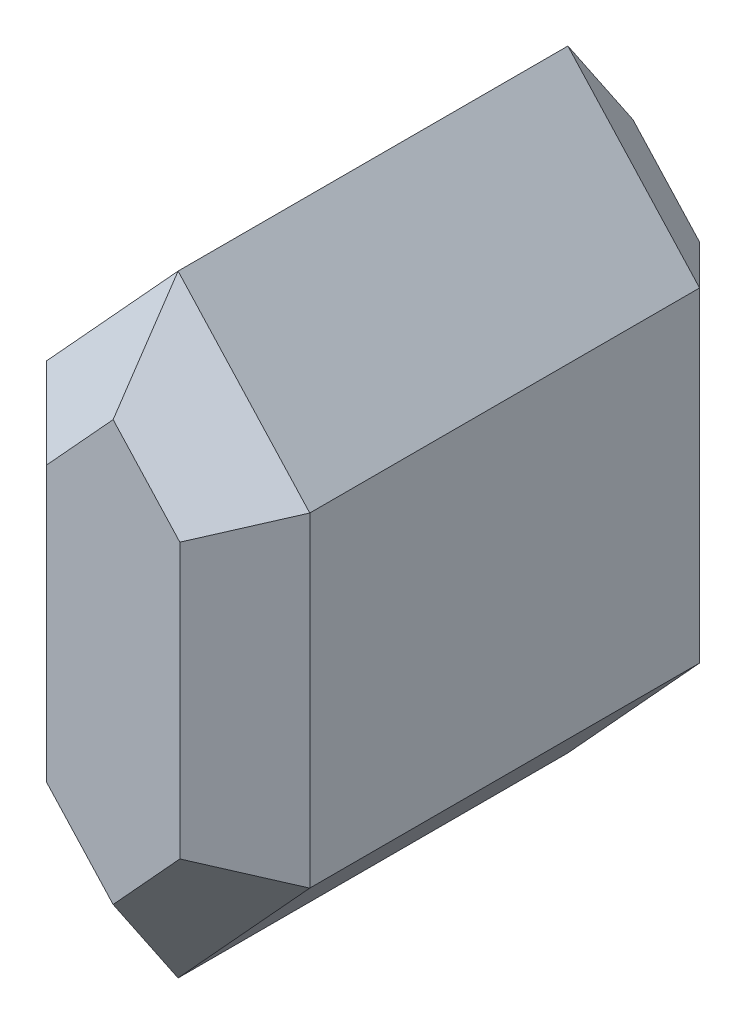
ISO-10303-21;
HEADER;
FILE_DESCRIPTION(('STEP AP214'),'2;1');
FILE_NAME('part.step','',(''),(''),'','','');
FILE_SCHEMA(('AUTOMOTIVE_DESIGN { 1 0 10303 214 1 1 1 1 }'));
ENDSEC;
DATA;
#1=APPLICATION_CONTEXT('core data for automotive mechanical design processes');
#2=APPLICATION_PROTOCOL_DEFINITION('international standard','automotive_design',2000,#1);
#3=PRODUCT_CONTEXT('',#1,'mechanical');
#4=PRODUCT('Part','Part','',(#3));
#5=PRODUCT_RELATED_PRODUCT_CATEGORY('part','',(#4));
#6=PRODUCT_DEFINITION_FORMATION('','',#4);
#7=PRODUCT_DEFINITION_CONTEXT('part definition',#1,'design');
#8=PRODUCT_DEFINITION('design','',#6,#7);
#9=PRODUCT_DEFINITION_SHAPE('','',#8);
#10=(LENGTH_UNIT() NAMED_UNIT(*) SI_UNIT(.MILLI.,.METRE.));
#11=(NAMED_UNIT(*) PLANE_ANGLE_UNIT() SI_UNIT($,.RADIAN.));
#12=(NAMED_UNIT(*) SI_UNIT($,.STERADIAN.) SOLID_ANGLE_UNIT());
#13=UNCERTAINTY_MEASURE_WITH_UNIT(LENGTH_MEASURE(1.E-05),#10,'distance_accuracy_value','');
#14=(GEOMETRIC_REPRESENTATION_CONTEXT(3) GLOBAL_UNCERTAINTY_ASSIGNED_CONTEXT((#13)) GLOBAL_UNIT_ASSIGNED_CONTEXT((#10,
#11,#12)) REPRESENTATION_CONTEXT('',''));
#15=CARTESIAN_POINT('',(0.,0.,0.));
#16=DIRECTION('',(0.,0.,1.));
#17=DIRECTION('',(1.,0.,0.));
#18=AXIS2_PLACEMENT_3D('',#15,#16,#17);
#19=CARTESIAN_POINT('',(0.,0.,15.2));
#20=DIRECTION('',(-0.737277336810123,0.675590207615662,0.));
#21=DIRECTION('',(-0.675590207615662,-0.737277336810123,0.));
#22=AXIS2_PLACEMENT_3D('',#19,#20,#21);
#23=PLANE('',#22);
#24=DIRECTION('',(0.,0.,-1.));
#25=VECTOR('',#24,1.);
#26=CARTESIAN_POINT('',(3.8508641834093,4.20248081981773,15.2));
#27=LINE('',#26,#25);
#28=CARTESIAN_POINT('',(3.8508641834093,4.20248081981773,13.3));
#29=VERTEX_POINT('',#28);
#30=CARTESIAN_POINT('',(3.8508641834093,4.20248081981773,1.9));
#31=VERTEX_POINT('',#30);
#32=EDGE_CURVE('E154',#29,#31,#27,.T.);
#33=ORIENTED_EDGE('',*,*,#32,.F.);
#34=DIRECTION('',(-0.675590207615662,-0.737277336810123,0.));
#35=VECTOR('',#34,1.);
#36=CARTESIAN_POINT('',(0.,0.,13.3));
#37=LINE('',#36,#35);
#38=CARTESIAN_POINT('',(0.,0.,13.3));
#39=VERTEX_POINT('',#38);
#40=EDGE_CURVE('E187',#29,#39,#37,.T.);
#41=ORIENTED_EDGE('',*,*,#40,.T.);
#42=DIRECTION('',(0.,0.,-1.));
#43=VECTOR('',#42,1.);
#44=CARTESIAN_POINT('',(0.,0.,15.2));
#45=LINE('',#44,#43);
#46=CARTESIAN_POINT('',(0.,0.,1.9));
#47=VERTEX_POINT('',#46);
#48=EDGE_CURVE('E208',#39,#47,#45,.T.);
#49=ORIENTED_EDGE('',*,*,#48,.T.);
#50=DIRECTION('',(0.675590207615662,0.737277336810123,0.));
#51=VECTOR('',#50,1.);
#52=CARTESIAN_POINT('',(3.8508641834093,4.20248081981773,1.9));
#53=LINE('',#52,#51);
#54=EDGE_CURVE('E185',#47,#31,#53,.T.);
#55=ORIENTED_EDGE('',*,*,#54,.T.);
#56=EDGE_LOOP('',(#33,#41,#49,#55));
#57=FACE_BOUND('',#56,.T.);
#58=ADVANCED_FACE('F45',(#57),#23,.F.);
#59=CARTESIAN_POINT('',(3.8508641834093,4.20248081981773,15.2));
#60=DIRECTION('',(-1.,0.,0.));
#61=DIRECTION('',(0.,0.,1.));
#62=AXIS2_PLACEMENT_3D('',#59,#60,#61);
#63=PLANE('',#62);
#64=DIRECTION('',(0.,0.,-1.));
#65=VECTOR('',#64,1.);
#66=CARTESIAN_POINT('',(3.8508641834093,13.7024808198177,15.2));
#67=LINE('',#66,#65);
#68=CARTESIAN_POINT('',(3.8508641834093,13.7024808198177,13.3));
#69=VERTEX_POINT('',#68);
#70=CARTESIAN_POINT('',(3.8508641834093,13.7024808198177,1.9));
#71=VERTEX_POINT('',#70);
#72=EDGE_CURVE('E250',#69,#71,#67,.T.);
#73=ORIENTED_EDGE('',*,*,#72,.F.);
#74=DIRECTION('',(0.,-1.,0.));
#75=VECTOR('',#74,1.);
#76=CARTESIAN_POINT('',(3.8508641834093,4.20248081981773,13.3));
#77=LINE('',#76,#75);
#78=EDGE_CURVE('E183',#69,#29,#77,.T.);
#79=ORIENTED_EDGE('',*,*,#78,.T.);
#80=ORIENTED_EDGE('',*,*,#32,.T.);
#81=DIRECTION('',(0.,1.,0.));
#82=VECTOR('',#81,1.);
#83=CARTESIAN_POINT('',(3.8508641834093,13.7024808198177,1.9));
#84=LINE('',#83,#82);
#85=EDGE_CURVE('E180',#31,#71,#84,.T.);
#86=ORIENTED_EDGE('',*,*,#85,.T.);
#87=EDGE_LOOP('',(#73,#79,#80,#86));
#88=FACE_BOUND('',#87,.T.);
#89=ADVANCED_FACE('F247',(#88),#63,.F.);
#90=CARTESIAN_POINT('',(0.,17.9049616396354,15.2));
#91=DIRECTION('',(-0.737277336810123,-0.675590207615661,0.));
#92=DIRECTION('',(0.675590207615661,-0.737277336810123,0.));
#93=AXIS2_PLACEMENT_3D('',#90,#91,#92);
#94=PLANE('',#93);
#95=DIRECTION('',(0.,0.,-1.));
#96=VECTOR('',#95,1.);
#97=CARTESIAN_POINT('',(0.,17.9049616396354,15.2));
#98=LINE('',#97,#96);
#99=CARTESIAN_POINT('',(0.,17.9049616396354,13.3));
#100=VERTEX_POINT('',#99);
#101=CARTESIAN_POINT('',(0.,17.9049616396354,1.9));
#102=VERTEX_POINT('',#101);
#103=EDGE_CURVE('E252',#100,#102,#98,.T.);
#104=ORIENTED_EDGE('',*,*,#103,.F.);
#105=DIRECTION('',(0.675590207615661,-0.737277336810123,0.));
#106=VECTOR('',#105,1.);
#107=CARTESIAN_POINT('',(0.,17.9049616396354,13.3));
#108=LINE('',#107,#106);
#109=EDGE_CURVE('E178',#100,#69,#108,.T.);
#110=ORIENTED_EDGE('',*,*,#109,.T.);
#111=ORIENTED_EDGE('',*,*,#72,.T.);
#112=DIRECTION('',(-0.675590207615661,0.737277336810123,0.));
#113=VECTOR('',#112,1.);
#114=CARTESIAN_POINT('',(0.,17.9049616396354,1.9));
#115=LINE('',#114,#113);
#116=EDGE_CURVE('E176',#71,#102,#115,.T.);
#117=ORIENTED_EDGE('',*,*,#116,.T.);
#118=EDGE_LOOP('',(#104,#110,#111,#117));
#119=FACE_BOUND('',#118,.T.);
#120=ADVANCED_FACE('F306',(#119),#94,.F.);
#121=CARTESIAN_POINT('',(0.,17.9049616396354,15.2));
#122=DIRECTION('',(0.737277336810123,-0.675590207615662,0.));
#123=DIRECTION('',(0.675590207615662,0.737277336810123,0.));
#124=AXIS2_PLACEMENT_3D('',#121,#122,#123);
#125=PLANE('',#124);
#126=DIRECTION('',(0.,0.,-1.));
#127=VECTOR('',#126,1.);
#128=CARTESIAN_POINT('',(-3.85086418340924,13.7024808198177,15.2));
#129=LINE('',#128,#127);
#130=CARTESIAN_POINT('',(-3.85086418340924,13.7024808198177,13.3));
#131=VERTEX_POINT('',#130);
#132=CARTESIAN_POINT('',(-3.85086418340924,13.7024808198177,1.9));
#133=VERTEX_POINT('',#132);
#134=EDGE_CURVE('E277',#131,#133,#129,.T.);
#135=ORIENTED_EDGE('',*,*,#134,.F.);
#136=DIRECTION('',(0.675590207615662,0.737277336810123,0.));
#137=VECTOR('',#136,1.);
#138=CARTESIAN_POINT('',(0.,17.9049616396354,13.3));
#139=LINE('',#138,#137);
#140=EDGE_CURVE('E174',#131,#100,#139,.T.);
#141=ORIENTED_EDGE('',*,*,#140,.T.);
#142=ORIENTED_EDGE('',*,*,#103,.T.);
#143=DIRECTION('',(-0.675590207615662,-0.737277336810123,0.));
#144=VECTOR('',#143,1.);
#145=CARTESIAN_POINT('',(-3.85086418340924,13.7024808198177,1.9));
#146=LINE('',#145,#144);
#147=EDGE_CURVE('E172',#102,#133,#146,.T.);
#148=ORIENTED_EDGE('',*,*,#147,.T.);
#149=EDGE_LOOP('',(#135,#141,#142,#148));
#150=FACE_BOUND('',#149,.T.);
#151=ADVANCED_FACE('F284',(#150),#125,.F.);
#152=CARTESIAN_POINT('',(-3.85086418340924,13.7024808198177,15.2));
#153=DIRECTION('',(1.,0.,0.));
#154=DIRECTION('',(0.,0.,-1.));
#155=AXIS2_PLACEMENT_3D('',#152,#153,#154);
#156=PLANE('',#155);
#157=DIRECTION('',(0.,0.,-1.));
#158=VECTOR('',#157,1.);
#159=CARTESIAN_POINT('',(-3.85086418340924,4.20248081981773,15.2));
#160=LINE('',#159,#158);
#161=CARTESIAN_POINT('',(-3.85086418340924,4.20248081981773,13.3));
#162=VERTEX_POINT('',#161);
#163=CARTESIAN_POINT('',(-3.85086418340924,4.20248081981773,1.9));
#164=VERTEX_POINT('',#163);
#165=EDGE_CURVE('E275',#162,#164,#160,.T.);
#166=ORIENTED_EDGE('',*,*,#165,.F.);
#167=DIRECTION('',(0.,1.,0.));
#168=VECTOR('',#167,1.);
#169=CARTESIAN_POINT('',(-3.85086418340924,13.7024808198177,13.3));
#170=LINE('',#169,#168);
#171=EDGE_CURVE('E170',#162,#131,#170,.T.);
#172=ORIENTED_EDGE('',*,*,#171,.T.);
#173=ORIENTED_EDGE('',*,*,#134,.T.);
#174=DIRECTION('',(0.,-1.,0.));
#175=VECTOR('',#174,1.);
#176=CARTESIAN_POINT('',(-3.85086418340924,4.20248081981773,1.9));
#177=LINE('',#176,#175);
#178=EDGE_CURVE('E168',#133,#164,#177,.T.);
#179=ORIENTED_EDGE('',*,*,#178,.T.);
#180=EDGE_LOOP('',(#166,#172,#173,#179));
#181=FACE_BOUND('',#180,.T.);
#182=ADVANCED_FACE('F276',(#181),#156,.F.);
#183=CARTESIAN_POINT('',(-3.85086418340924,4.20248081981773,15.2));
#184=DIRECTION('',(0.737277336810128,0.675590207615656,0.));
#185=DIRECTION('',(-0.675590207615656,0.737277336810128,0.));
#186=AXIS2_PLACEMENT_3D('',#183,#184,#185);
#187=PLANE('',#186);
#188=ORIENTED_EDGE('',*,*,#48,.F.);
#189=DIRECTION('',(-0.675590207615656,0.737277336810128,0.));
#190=VECTOR('',#189,1.);
#191=CARTESIAN_POINT('',(-3.85086418340924,4.20248081981773,13.3));
#192=LINE('',#191,#190);
#193=EDGE_CURVE('E141',#39,#162,#192,.T.);
#194=ORIENTED_EDGE('',*,*,#193,.T.);
#195=ORIENTED_EDGE('',*,*,#165,.T.);
#196=DIRECTION('',(0.675590207615656,-0.737277336810128,0.));
#197=VECTOR('',#196,1.);
#198=CARTESIAN_POINT('',(0.,0.,1.9));
#199=LINE('',#198,#197);
#200=EDGE_CURVE('E160',#164,#47,#199,.T.);
#201=ORIENTED_EDGE('',*,*,#200,.T.);
#202=EDGE_LOOP('',(#188,#194,#195,#201));
#203=FACE_BOUND('',#202,.T.);
#204=ADVANCED_FACE('F274',(#203),#187,.F.);
#205=CARTESIAN_POINT('',(0.,0.,15.2));
#206=DIRECTION('',(0.,0.,-1.));
#207=DIRECTION('',(-1.,0.,0.));
#208=AXIS2_PLACEMENT_3D('',#205,#206,#207);
#209=PLANE('',#208);
#210=DIRECTION('',(0.,-1.,0.));
#211=VECTOR('',#210,1.);
#212=CARTESIAN_POINT('',(-1.95086418340924,0.,15.2));
#213=LINE('',#212,#211);
#214=CARTESIAN_POINT('',(-1.95086418340924,12.963611229297,15.2));
#215=VERTEX_POINT('',#214);
#216=CARTESIAN_POINT('',(-1.95086418340924,4.9413504103384,15.2));
#217=VERTEX_POINT('',#216);
#218=EDGE_CURVE('E158',#215,#217,#213,.T.);
#219=ORIENTED_EDGE('',*,*,#218,.T.);
#220=DIRECTION('',(0.675590207615656,-0.737277336810128,0.));
#221=VECTOR('',#220,1.);
#222=CARTESIAN_POINT('',(1.40082693993924,1.28362139446975,15.2));
#223=LINE('',#222,#221);
#224=CARTESIAN_POINT('',(0.,2.8123557425523,15.2));
#225=VERTEX_POINT('',#224);
#226=EDGE_CURVE('E139',#217,#225,#223,.T.);
#227=ORIENTED_EDGE('',*,*,#226,.T.);
#228=DIRECTION('',(0.675590207615662,0.737277336810123,0.));
#229=VECTOR('',#228,1.);
#230=CARTESIAN_POINT('',(-1.40082693993923,1.28362139446976,15.2));
#231=LINE('',#230,#229);
#232=CARTESIAN_POINT('',(1.9508641834093,4.94135041033841,15.2));
#233=VERTEX_POINT('',#232);
#234=EDGE_CURVE('E147',#225,#233,#231,.T.);
#235=ORIENTED_EDGE('',*,*,#234,.T.);
#236=DIRECTION('',(0.,1.,0.));
#237=VECTOR('',#236,1.);
#238=CARTESIAN_POINT('',(1.9508641834093,0.,15.2));
#239=LINE('',#238,#237);
#240=CARTESIAN_POINT('',(1.9508641834093,12.9636112292971,15.2));
#241=VERTEX_POINT('',#240);
#242=EDGE_CURVE('E153',#233,#241,#239,.T.);
#243=ORIENTED_EDGE('',*,*,#242,.T.);
#244=DIRECTION('',(-0.675590207615661,0.737277336810123,0.));
#245=VECTOR('',#244,1.);
#246=CARTESIAN_POINT('',(7.51758698753124,6.88859931006262,15.2));
#247=LINE('',#246,#245);
#248=CARTESIAN_POINT('',(0.,15.0926058970831,15.2));
#249=VERTEX_POINT('',#248);
#250=EDGE_CURVE('E257',#241,#249,#247,.T.);
#251=ORIENTED_EDGE('',*,*,#250,.T.);
#252=DIRECTION('',(-0.675590207615662,-0.737277336810123,0.));
#253=VECTOR('',#252,1.);
#254=CARTESIAN_POINT('',(-7.5175869875312,6.8885993100626,15.2));
#255=LINE('',#254,#253);
#256=EDGE_CURVE('E163',#249,#215,#255,.T.);
#257=ORIENTED_EDGE('',*,*,#256,.T.);
#258=EDGE_LOOP('',(#219,#227,#235,#243,#251,#257));
#259=FACE_BOUND('',#258,.T.);
#260=ADVANCED_FACE('F156',(#259),#209,.F.);
#261=CARTESIAN_POINT('',(0.,0.,0.));
#262=DIRECTION('',(0.,0.,-1.));
#263=DIRECTION('',(-1.,0.,0.));
#264=AXIS2_PLACEMENT_3D('',#261,#262,#263);
#265=PLANE('',#264);
#266=DIRECTION('',(0.675590207615661,-0.737277336810123,0.));
#267=VECTOR('',#266,1.);
#268=CARTESIAN_POINT('',(2.45003724347006,12.418859425348,0.));
#269=LINE('',#268,#267);
#270=CARTESIAN_POINT('',(0.,15.0926058970831,0.));
#271=VERTEX_POINT('',#270);
#272=CARTESIAN_POINT('',(1.95086418340929,12.963611229297,0.));
#273=VERTEX_POINT('',#272);
#274=EDGE_CURVE('E54',#271,#273,#269,.T.);
#275=ORIENTED_EDGE('',*,*,#274,.T.);
#276=DIRECTION('',(0.,-1.,0.));
#277=VECTOR('',#276,1.);
#278=CARTESIAN_POINT('',(1.95086418340929,4.20248081981773,0.));
#279=LINE('',#278,#277);
#280=CARTESIAN_POINT('',(1.95086418340929,4.94135041033842,0.));
#281=VERTEX_POINT('',#280);
#282=EDGE_CURVE('E11',#273,#281,#279,.T.);
#283=ORIENTED_EDGE('',*,*,#282,.T.);
#284=DIRECTION('',(-0.675590207615662,-0.737277336810123,0.));
#285=VECTOR('',#284,1.);
#286=CARTESIAN_POINT('',(-1.40082693993924,1.28362139446976,0.));
#287=LINE('',#286,#285);
#288=CARTESIAN_POINT('',(0.,2.81235574255231,0.));
#289=VERTEX_POINT('',#288);
#290=EDGE_CURVE('E189',#281,#289,#287,.T.);
#291=ORIENTED_EDGE('',*,*,#290,.T.);
#292=DIRECTION('',(-0.675590207615656,0.737277336810128,0.));
#293=VECTOR('',#292,1.);
#294=CARTESIAN_POINT('',(-2.45003724346999,5.48610221428748,0.));
#295=LINE('',#294,#293);
#296=CARTESIAN_POINT('',(-1.95086418340923,4.94135041033841,0.));
#297=VERTEX_POINT('',#296);
#298=EDGE_CURVE('E191',#289,#297,#295,.T.);
#299=ORIENTED_EDGE('',*,*,#298,.T.);
#300=DIRECTION('',(0.,1.,0.));
#301=VECTOR('',#300,1.);
#302=CARTESIAN_POINT('',(-1.95086418340923,13.7024808198177,0.));
#303=LINE('',#302,#301);
#304=CARTESIAN_POINT('',(-1.95086418340923,12.963611229297,0.));
#305=VERTEX_POINT('',#304);
#306=EDGE_CURVE('E193',#297,#305,#303,.T.);
#307=ORIENTED_EDGE('',*,*,#306,.T.);
#308=DIRECTION('',(0.675590207615662,0.737277336810123,0.));
#309=VECTOR('',#308,1.);
#310=CARTESIAN_POINT('',(1.40082693993927,16.6213402451657,0.));
#311=LINE('',#310,#309);
#312=EDGE_CURVE('E65',#305,#271,#311,.T.);
#313=ORIENTED_EDGE('',*,*,#312,.T.);
#314=EDGE_LOOP('',(#275,#283,#291,#299,#307,#313));
#315=FACE_BOUND('',#314,.T.);
#316=ADVANCED_FACE('F233',(#315),#265,.T.);
#317=CARTESIAN_POINT('',(7.51758698753124,6.88859931006262,15.2));
#318=DIRECTION('',(-0.521333804473597,-0.477714417108262,-0.707106781186547));
#319=DIRECTION('',(-0.675590207615661,0.737277336810123,0.));
#320=AXIS2_PLACEMENT_3D('',#317,#318,#319);
#321=PLANE('',#320);
#322=DIRECTION('',(-0.681799869032535,-0.265137468446907,0.681799869032536));
#323=VECTOR('',#322,1.);
#324=CARTESIAN_POINT('',(-0.392576779771877,12.0522968793628,17.5434409631812));
#325=LINE('',#324,#323);
#326=EDGE_CURVE('E202',#69,#241,#325,.T.);
#327=ORIENTED_EDGE('',*,*,#326,.F.);
#328=ORIENTED_EDGE('',*,*,#109,.F.);
#329=DIRECTION('',(0.,-0.828621820397707,0.559808787677355));
#330=VECTOR('',#329,1.);
#331=CARTESIAN_POINT('',(0.,9.45961912369536,19.0055907037293));
#332=LINE('',#331,#330);
#333=EDGE_CURVE('E205',#249,#100,#332,.F.);
#334=ORIENTED_EDGE('',*,*,#333,.F.);
#335=ORIENTED_EDGE('',*,*,#250,.F.);
#336=EDGE_LOOP('',(#327,#328,#334,#335));
#337=FACE_BOUND('',#336,.T.);
#338=ADVANCED_FACE('F321',(#337),#321,.F.);
#339=CARTESIAN_POINT('',(-7.5175869875312,6.8885993100626,15.2));
#340=DIRECTION('',(0.521333804473596,-0.477714417108262,-0.707106781186547));
#341=DIRECTION('',(-0.675590207615662,-0.737277336810123,0.));
#342=AXIS2_PLACEMENT_3D('',#339,#340,#341);
#343=PLANE('',#342);
#344=ORIENTED_EDGE('',*,*,#333,.T.);
#345=ORIENTED_EDGE('',*,*,#140,.F.);
#346=DIRECTION('',(0.681799869032535,-0.265137468446908,0.681799869032536));
#347=VECTOR('',#346,1.);
#348=CARTESIAN_POINT('',(-3.4403770834268,13.5428511169345,13.7104870999824));
#349=LINE('',#348,#347);
#350=EDGE_CURVE('E199',#215,#131,#349,.F.);
#351=ORIENTED_EDGE('',*,*,#350,.F.);
#352=ORIENTED_EDGE('',*,*,#256,.F.);
#353=EDGE_LOOP('',(#344,#345,#351,#352));
#354=FACE_BOUND('',#353,.T.);
#355=ADVANCED_FACE('F264',(#354),#343,.F.);
#356=CARTESIAN_POINT('',(1.9508641834093,0.,15.2));
#357=DIRECTION('',(-0.707106781186548,0.,-0.707106781186547));
#358=DIRECTION('',(0.,1.,0.));
#359=AXIS2_PLACEMENT_3D('',#356,#357,#358);
#360=PLANE('',#359);
#361=ORIENTED_EDGE('',*,*,#326,.T.);
#362=ORIENTED_EDGE('',*,*,#242,.F.);
#363=DIRECTION('',(-0.681799869032535,0.265137468446908,0.681799869032536));
#364=VECTOR('',#363,1.);
#365=CARTESIAN_POINT('',(1.05403720984322,5.29010734651035,16.0968269735661));
#366=LINE('',#365,#364);
#367=EDGE_CURVE('E150',#29,#233,#366,.T.);
#368=ORIENTED_EDGE('',*,*,#367,.F.);
#369=ORIENTED_EDGE('',*,*,#78,.F.);
#370=EDGE_LOOP('',(#361,#362,#368,#369));
#371=FACE_BOUND('',#370,.T.);
#372=ADVANCED_FACE('F316',(#371),#360,.F.);
#373=CARTESIAN_POINT('',(-1.95086418340924,0.,15.2));
#374=DIRECTION('',(0.707106781186548,0.,-0.707106781186547));
#375=DIRECTION('',(0.,-1.,0.));
#376=AXIS2_PLACEMENT_3D('',#373,#374,#375);
#377=PLANE('',#376);
#378=ORIENTED_EDGE('',*,*,#350,.T.);
#379=ORIENTED_EDGE('',*,*,#171,.F.);
#380=DIRECTION('',(0.681799869032536,0.265137468446905,0.681799869032537));
#381=VECTOR('',#380,1.);
#382=CARTESIAN_POINT('',(-2.84411551285743,4.5939839661166,14.3067486705518));
#383=LINE('',#382,#381);
#384=EDGE_CURVE('E144',#217,#162,#383,.F.);
#385=ORIENTED_EDGE('',*,*,#384,.F.);
#386=ORIENTED_EDGE('',*,*,#218,.F.);
#387=EDGE_LOOP('',(#378,#379,#385,#386));
#388=FACE_BOUND('',#387,.T.);
#389=ADVANCED_FACE('F267',(#388),#377,.F.);
#390=CARTESIAN_POINT('',(-1.40082693993923,1.28362139446976,15.2));
#391=DIRECTION('',(-0.521333804473596,0.477714417108262,-0.707106781186547));
#392=DIRECTION('',(0.675590207615662,0.737277336810123,0.));
#393=AXIS2_PLACEMENT_3D('',#390,#391,#392);
#394=PLANE('',#393);
#395=ORIENTED_EDGE('',*,*,#367,.T.);
#396=ORIENTED_EDGE('',*,*,#234,.F.);
#397=DIRECTION('',(0.,-0.828621820397708,-0.559808787677353));
#398=VECTOR('',#397,1.);
#399=CARTESIAN_POINT('',(0.,1.7627051515354,14.490866339291));
#400=LINE('',#399,#398);
#401=EDGE_CURVE('E135',#39,#225,#400,.F.);
#402=ORIENTED_EDGE('',*,*,#401,.F.);
#403=ORIENTED_EDGE('',*,*,#40,.F.);
#404=EDGE_LOOP('',(#395,#396,#402,#403));
#405=FACE_BOUND('',#404,.T.);
#406=ADVANCED_FACE('F148',(#405),#394,.F.);
#407=CARTESIAN_POINT('',(1.40082693993924,1.28362139446975,15.2));
#408=DIRECTION('',(0.5213338044736,0.477714417108258,-0.707106781186547));
#409=DIRECTION('',(0.675590207615656,-0.737277336810128,0.));
#410=AXIS2_PLACEMENT_3D('',#407,#408,#409);
#411=PLANE('',#410);
#412=ORIENTED_EDGE('',*,*,#384,.T.);
#413=ORIENTED_EDGE('',*,*,#193,.F.);
#414=ORIENTED_EDGE('',*,*,#401,.T.);
#415=ORIENTED_EDGE('',*,*,#226,.F.);
#416=EDGE_LOOP('',(#412,#413,#414,#415));
#417=FACE_BOUND('',#416,.T.);
#418=ADVANCED_FACE('F137',(#417),#411,.F.);
#419=CARTESIAN_POINT('',(-3.85086418340924,13.7024808198177,1.9));
#420=DIRECTION('',(-0.707106781186547,0.,-0.707106781186549));
#421=DIRECTION('',(0.,1.,0.));
#422=AXIS2_PLACEMENT_3D('',#419,#420,#421);
#423=PLANE('',#422);
#424=DIRECTION('',(0.681799869032536,-0.265137468446909,-0.681799869032534));
#425=VECTOR('',#424,1.);
#426=CARTESIAN_POINT('',(-3.85086418340924,13.7024808198177,1.9));
#427=LINE('',#426,#425);
#428=EDGE_CURVE('E218',#305,#133,#427,.F.);
#429=ORIENTED_EDGE('',*,*,#428,.F.);
#430=ORIENTED_EDGE('',*,*,#306,.F.);
#431=DIRECTION('',(0.681799869032537,0.265137468446905,-0.681799869032535));
#432=VECTOR('',#431,1.);
#433=CARTESIAN_POINT('',(-3.85086418340924,4.20248081981773,1.9));
#434=LINE('',#433,#432);
#435=EDGE_CURVE('E49',#164,#297,#434,.T.);
#436=ORIENTED_EDGE('',*,*,#435,.F.);
#437=ORIENTED_EDGE('',*,*,#178,.F.);
#438=EDGE_LOOP('',(#429,#430,#436,#437));
#439=FACE_BOUND('',#438,.T.);
#440=ADVANCED_FACE('F47',(#439),#423,.T.);
#441=CARTESIAN_POINT('',(-3.85086418340924,4.20248081981773,1.9));
#442=DIRECTION('',(-0.521333804473599,-0.477714417108257,-0.707106781186549));
#443=DIRECTION('',(-0.675590207615656,0.737277336810128,0.));
#444=AXIS2_PLACEMENT_3D('',#441,#442,#443);
#445=PLANE('',#444);
#446=ORIENTED_EDGE('',*,*,#435,.T.);
#447=ORIENTED_EDGE('',*,*,#298,.F.);
#448=DIRECTION('',(0.,0.828621820397709,-0.559808787677352));
#449=VECTOR('',#448,1.);
#450=CARTESIAN_POINT('',(0.,0.,1.9));
#451=LINE('',#450,#449);
#452=EDGE_CURVE('E216',#47,#289,#451,.T.);
#453=ORIENTED_EDGE('',*,*,#452,.F.);
#454=ORIENTED_EDGE('',*,*,#200,.F.);
#455=EDGE_LOOP('',(#446,#447,#453,#454));
#456=FACE_BOUND('',#455,.T.);
#457=ADVANCED_FACE('F228',(#456),#445,.T.);
#458=CARTESIAN_POINT('',(0.,17.9049616396354,1.9));
#459=DIRECTION('',(-0.521333804473595,0.477714417108261,-0.707106781186549));
#460=DIRECTION('',(0.675590207615662,0.737277336810123,0.));
#461=AXIS2_PLACEMENT_3D('',#458,#459,#460);
#462=PLANE('',#461);
#463=ORIENTED_EDGE('',*,*,#428,.T.);
#464=ORIENTED_EDGE('',*,*,#147,.F.);
#465=DIRECTION('',(0.,-0.828621820397708,-0.559808787677353));
#466=VECTOR('',#465,1.);
#467=CARTESIAN_POINT('',(0.,17.9049616396354,1.9));
#468=LINE('',#467,#466);
#469=EDGE_CURVE('E213',#271,#102,#468,.F.);
#470=ORIENTED_EDGE('',*,*,#469,.F.);
#471=ORIENTED_EDGE('',*,*,#312,.F.);
#472=EDGE_LOOP('',(#463,#464,#470,#471));
#473=FACE_BOUND('',#472,.T.);
#474=ADVANCED_FACE('F287',(#473),#462,.T.);
#475=CARTESIAN_POINT('',(0.,0.,1.9));
#476=DIRECTION('',(0.521333804473595,-0.477714417108261,-0.707106781186549));
#477=DIRECTION('',(-0.675590207615662,-0.737277336810123,0.));
#478=AXIS2_PLACEMENT_3D('',#475,#476,#477);
#479=PLANE('',#478);
#480=ORIENTED_EDGE('',*,*,#452,.T.);
#481=ORIENTED_EDGE('',*,*,#290,.F.);
#482=DIRECTION('',(0.681799869032536,-0.265137468446908,0.681799869032535));
#483=VECTOR('',#482,1.);
#484=CARTESIAN_POINT('',(2.82047124321179,4.60317871971201,0.869607059802493));
#485=LINE('',#484,#483);
#486=EDGE_CURVE('E211',#31,#281,#485,.F.);
#487=ORIENTED_EDGE('',*,*,#486,.F.);
#488=ORIENTED_EDGE('',*,*,#54,.F.);
#489=EDGE_LOOP('',(#480,#481,#487,#488));
#490=FACE_BOUND('',#489,.T.);
#491=ADVANCED_FACE('F237',(#490),#479,.T.);
#492=CARTESIAN_POINT('',(0.,17.9049616396354,1.9));
#493=DIRECTION('',(0.521333804473595,0.477714417108261,-0.707106781186549));
#494=DIRECTION('',(0.675590207615661,-0.737277336810123,0.));
#495=AXIS2_PLACEMENT_3D('',#492,#493,#494);
#496=PLANE('',#495);
#497=ORIENTED_EDGE('',*,*,#469,.T.);
#498=ORIENTED_EDGE('',*,*,#116,.F.);
#499=DIRECTION('',(-0.681799869032536,-0.265137468446909,-0.681799869032534));
#500=VECTOR('',#499,1.);
#501=CARTESIAN_POINT('',(2.8204712432118,13.3017829199235,0.869607059802507));
#502=LINE('',#501,#500);
#503=EDGE_CURVE('E209',#273,#71,#502,.F.);
#504=ORIENTED_EDGE('',*,*,#503,.F.);
#505=ORIENTED_EDGE('',*,*,#274,.F.);
#506=EDGE_LOOP('',(#497,#498,#504,#505));
#507=FACE_BOUND('',#506,.T.);
#508=ADVANCED_FACE('F290',(#507),#496,.T.);
#509=CARTESIAN_POINT('',(3.8508641834093,4.20248081981773,1.9));
#510=DIRECTION('',(0.707106781186547,0.,-0.707106781186549));
#511=DIRECTION('',(0.,-1.,0.));
#512=AXIS2_PLACEMENT_3D('',#509,#510,#511);
#513=PLANE('',#512);
#514=ORIENTED_EDGE('',*,*,#486,.T.);
#515=ORIENTED_EDGE('',*,*,#282,.F.);
#516=ORIENTED_EDGE('',*,*,#503,.T.);
#517=ORIENTED_EDGE('',*,*,#85,.F.);
#518=EDGE_LOOP('',(#514,#515,#516,#517));
#519=FACE_BOUND('',#518,.T.);
#520=ADVANCED_FACE('F293',(#519),#513,.T.);
#521=CLOSED_SHELL('',(#58,#89,#120,#151,#182,#204,#260,#316,#338,#355,#372,#389,#406,#418,#440,
#457,#474,#491,#508,#520));
#522=MANIFOLD_SOLID_BREP('B2',#521);
#523=ADVANCED_BREP_SHAPE_REPRESENTATION('',(#18,#522),#14);
#524=SHAPE_DEFINITION_REPRESENTATION(#9,#523);
ENDSEC;
END-ISO-10303-21;
